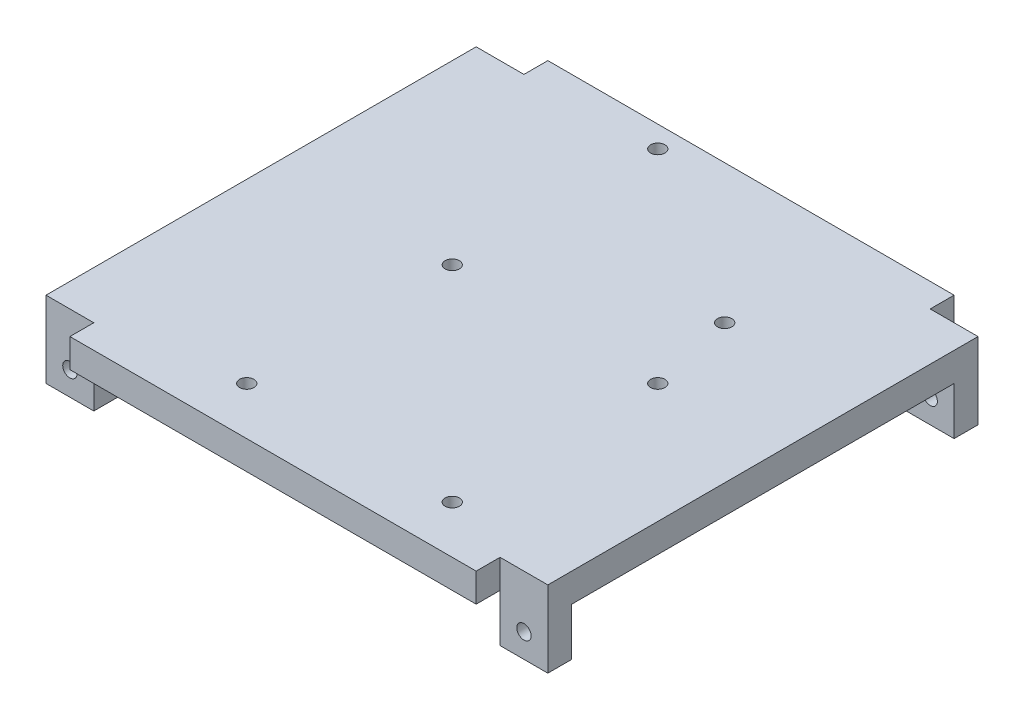
ISO-10303-21;
HEADER;
FILE_DESCRIPTION(('STEP AP214'),'2;1');
FILE_NAME('part.step','',(''),(''),'','','');
FILE_SCHEMA(('AUTOMOTIVE_DESIGN { 1 0 10303 214 1 1 1 1 }'));
ENDSEC;
DATA;
#1=APPLICATION_CONTEXT('core data for automotive mechanical design processes');
#2=APPLICATION_PROTOCOL_DEFINITION('international standard','automotive_design',2000,#1);
#3=PRODUCT_CONTEXT('',#1,'mechanical');
#4=PRODUCT('Part','Part','',(#3));
#5=PRODUCT_RELATED_PRODUCT_CATEGORY('part','',(#4));
#6=PRODUCT_DEFINITION_FORMATION('','',#4);
#7=PRODUCT_DEFINITION_CONTEXT('part definition',#1,'design');
#8=PRODUCT_DEFINITION('design','',#6,#7);
#9=PRODUCT_DEFINITION_SHAPE('','',#8);
#10=(LENGTH_UNIT() NAMED_UNIT(*) SI_UNIT(.MILLI.,.METRE.));
#11=(NAMED_UNIT(*) PLANE_ANGLE_UNIT() SI_UNIT($,.RADIAN.));
#12=(NAMED_UNIT(*) SI_UNIT($,.STERADIAN.) SOLID_ANGLE_UNIT());
#13=UNCERTAINTY_MEASURE_WITH_UNIT(LENGTH_MEASURE(1.E-05),#10,'distance_accuracy_value','');
#14=(GEOMETRIC_REPRESENTATION_CONTEXT(3) GLOBAL_UNCERTAINTY_ASSIGNED_CONTEXT((#13)) GLOBAL_UNIT_ASSIGNED_CONTEXT((#10,
#11,#12)) REPRESENTATION_CONTEXT('',''));
#15=CARTESIAN_POINT('',(0.,0.,0.));
#16=DIRECTION('',(0.,0.,1.));
#17=DIRECTION('',(1.,0.,0.));
#18=AXIS2_PLACEMENT_3D('',#15,#16,#17);
#19=CARTESIAN_POINT('',(0.,0.,0.));
#20=DIRECTION('',(0.,-1.,0.));
#21=DIRECTION('',(0.,0.,-1.));
#22=AXIS2_PLACEMENT_3D('',#19,#20,#21);
#23=PLANE('',#22);
#24=CARTESIAN_POINT('',(76.,0.,-71.));
#25=DIRECTION('',(0.,-1.,0.));
#26=DIRECTION('',(0.,0.,-1.));
#27=AXIS2_PLACEMENT_3D('',#24,#25,#26);
#28=CIRCLE('',#27,1.5);
#29=CARTESIAN_POINT('',(76.,0.,-72.5));
#30=VERTEX_POINT('',#29);
#31=EDGE_CURVE('E418',#30,#30,#28,.T.);
#32=ORIENTED_EDGE('',*,*,#31,.F.);
#33=EDGE_LOOP('',(#32));
#34=FACE_BOUND('',#33,.T.);
#35=CARTESIAN_POINT('',(37.5,0.,-95.5));
#36=DIRECTION('',(0.,-1.,0.));
#37=DIRECTION('',(0.,0.,-1.));
#38=AXIS2_PLACEMENT_3D('',#35,#36,#37);
#39=CIRCLE('',#38,1.5);
#40=CARTESIAN_POINT('',(37.5,0.,-97.));
#41=VERTEX_POINT('',#40);
#42=EDGE_CURVE('E412',#41,#41,#39,.T.);
#43=ORIENTED_EDGE('',*,*,#42,.F.);
#44=EDGE_LOOP('',(#43));
#45=FACE_BOUND('',#44,.T.);
#46=CARTESIAN_POINT('',(80.,0.,-10.));
#47=DIRECTION('',(0.,-1.,0.));
#48=DIRECTION('',(0.,0.,-1.));
#49=AXIS2_PLACEMENT_3D('',#46,#47,#48);
#50=CIRCLE('',#49,1.5);
#51=CARTESIAN_POINT('',(80.,0.,-11.5));
#52=VERTEX_POINT('',#51);
#53=EDGE_CURVE('E406',#52,#52,#50,.T.);
#54=ORIENTED_EDGE('',*,*,#53,.F.);
#55=EDGE_LOOP('',(#54));
#56=FACE_BOUND('',#55,.T.);
#57=CARTESIAN_POINT('',(80.,0.,-53.));
#58=DIRECTION('',(0.,-1.,0.));
#59=DIRECTION('',(0.,0.,-1.));
#60=AXIS2_PLACEMENT_3D('',#57,#58,#59);
#61=CIRCLE('',#60,1.5);
#62=CARTESIAN_POINT('',(80.,0.,-54.5));
#63=VERTEX_POINT('',#62);
#64=EDGE_CURVE('E400',#63,#63,#61,.T.);
#65=ORIENTED_EDGE('',*,*,#64,.F.);
#66=EDGE_LOOP('',(#65));
#67=FACE_BOUND('',#66,.T.);
#68=CARTESIAN_POINT('',(37.,0.,-53.));
#69=DIRECTION('',(0.,-1.,0.));
#70=DIRECTION('',(0.,0.,-1.));
#71=AXIS2_PLACEMENT_3D('',#68,#69,#70);
#72=CIRCLE('',#71,1.5);
#73=CARTESIAN_POINT('',(37.,0.,-54.5));
#74=VERTEX_POINT('',#73);
#75=EDGE_CURVE('E394',#74,#74,#72,.T.);
#76=ORIENTED_EDGE('',*,*,#75,.F.);
#77=EDGE_LOOP('',(#76));
#78=FACE_BOUND('',#77,.T.);
#79=CARTESIAN_POINT('',(37.,0.,-10.));
#80=DIRECTION('',(0.,-1.,0.));
#81=DIRECTION('',(0.,0.,-1.));
#82=AXIS2_PLACEMENT_3D('',#79,#80,#81);
#83=CIRCLE('',#82,1.5);
#84=CARTESIAN_POINT('',(37.,0.,-11.5));
#85=VERTEX_POINT('',#84);
#86=EDGE_CURVE('E388',#85,#85,#83,.T.);
#87=ORIENTED_EDGE('',*,*,#86,.F.);
#88=EDGE_LOOP('',(#87));
#89=FACE_BOUND('',#88,.T.);
#90=DIRECTION('',(-1.,0.,0.));
#91=VECTOR('',#90,1.);
#92=CARTESIAN_POINT('',(0.,0.,-90.));
#93=LINE('',#92,#91);
#94=CARTESIAN_POINT('',(9.99999999999999,0.,-90.));
#95=VERTEX_POINT('',#94);
#96=CARTESIAN_POINT('',(0.,0.,-90.));
#97=VERTEX_POINT('',#96);
#98=EDGE_CURVE('E214',#95,#97,#93,.T.);
#99=ORIENTED_EDGE('',*,*,#98,.F.);
#100=DIRECTION('',(0.,0.,1.));
#101=VECTOR('',#100,1.);
#102=CARTESIAN_POINT('',(9.99999999999998,0.,-95.));
#103=LINE('',#102,#101);
#104=CARTESIAN_POINT('',(9.99999999999998,0.,-95.));
#105=VERTEX_POINT('',#104);
#106=EDGE_CURVE('E216',#105,#95,#103,.T.);
#107=ORIENTED_EDGE('',*,*,#106,.F.);
#108=DIRECTION('',(0.,0.,1.));
#109=VECTOR('',#108,1.);
#110=CARTESIAN_POINT('',(10.,0.,-100.));
#111=LINE('',#110,#109);
#112=CARTESIAN_POINT('',(10.,0.,-100.));
#113=VERTEX_POINT('',#112);
#114=EDGE_CURVE('E326',#113,#105,#111,.T.);
#115=ORIENTED_EDGE('',*,*,#114,.F.);
#116=DIRECTION('',(-1.,0.,0.));
#117=VECTOR('',#116,1.);
#118=CARTESIAN_POINT('',(0.,0.,-100.));
#119=LINE('',#118,#117);
#120=CARTESIAN_POINT('',(95.,0.,-100.));
#121=VERTEX_POINT('',#120);
#122=EDGE_CURVE('E354',#121,#113,#119,.T.);
#123=ORIENTED_EDGE('',*,*,#122,.F.);
#124=DIRECTION('',(0.,0.,-1.));
#125=VECTOR('',#124,1.);
#126=CARTESIAN_POINT('',(95.,0.,-100.));
#127=LINE('',#126,#125);
#128=CARTESIAN_POINT('',(95.,0.,-95.));
#129=VERTEX_POINT('',#128);
#130=EDGE_CURVE('E336',#129,#121,#127,.T.);
#131=ORIENTED_EDGE('',*,*,#130,.F.);
#132=DIRECTION('',(0.,0.,-1.));
#133=VECTOR('',#132,1.);
#134=CARTESIAN_POINT('',(95.,0.,-95.));
#135=LINE('',#134,#133);
#136=CARTESIAN_POINT('',(95.,0.,-90.));
#137=VERTEX_POINT('',#136);
#138=EDGE_CURVE('E279',#137,#129,#135,.T.);
#139=ORIENTED_EDGE('',*,*,#138,.F.);
#140=DIRECTION('',(-1.,0.,0.));
#141=VECTOR('',#140,1.);
#142=CARTESIAN_POINT('',(105.,0.,-90.));
#143=LINE('',#142,#141);
#144=CARTESIAN_POINT('',(105.,0.,-90.));
#145=VERTEX_POINT('',#144);
#146=EDGE_CURVE('E274',#145,#137,#143,.T.);
#147=ORIENTED_EDGE('',*,*,#146,.F.);
#148=DIRECTION('',(0.,0.,-1.));
#149=VECTOR('',#148,1.);
#150=CARTESIAN_POINT('',(105.,0.,0.));
#151=LINE('',#150,#149);
#152=CARTESIAN_POINT('',(105.,0.,-10.));
#153=VERTEX_POINT('',#152);
#154=EDGE_CURVE('E50',#153,#145,#151,.T.);
#155=ORIENTED_EDGE('',*,*,#154,.F.);
#156=DIRECTION('',(1.,0.,0.));
#157=VECTOR('',#156,1.);
#158=CARTESIAN_POINT('',(105.,0.,-10.));
#159=LINE('',#158,#157);
#160=CARTESIAN_POINT('',(95.,0.,-10.));
#161=VERTEX_POINT('',#160);
#162=EDGE_CURVE('E259',#161,#153,#159,.T.);
#163=ORIENTED_EDGE('',*,*,#162,.F.);
#164=DIRECTION('',(0.,0.,-1.));
#165=VECTOR('',#164,1.);
#166=CARTESIAN_POINT('',(95.,0.,-5.00000000000001));
#167=LINE('',#166,#165);
#168=CARTESIAN_POINT('',(95.,0.,-5.00000000000001));
#169=VERTEX_POINT('',#168);
#170=EDGE_CURVE('E254',#169,#161,#167,.T.);
#171=ORIENTED_EDGE('',*,*,#170,.F.);
#172=DIRECTION('',(0.,0.,-1.));
#173=VECTOR('',#172,1.);
#174=CARTESIAN_POINT('',(95.,0.,0.));
#175=LINE('',#174,#173);
#176=CARTESIAN_POINT('',(95.,0.,0.));
#177=VERTEX_POINT('',#176);
#178=EDGE_CURVE('E310',#177,#169,#175,.T.);
#179=ORIENTED_EDGE('',*,*,#178,.F.);
#180=DIRECTION('',(1.,0.,0.));
#181=VECTOR('',#180,1.);
#182=CARTESIAN_POINT('',(0.,0.,0.));
#183=LINE('',#182,#181);
#184=CARTESIAN_POINT('',(10.,0.,0.));
#185=VERTEX_POINT('',#184);
#186=EDGE_CURVE('E58',#185,#177,#183,.T.);
#187=ORIENTED_EDGE('',*,*,#186,.F.);
#188=DIRECTION('',(0.,0.,1.));
#189=VECTOR('',#188,1.);
#190=CARTESIAN_POINT('',(10.,0.,0.));
#191=LINE('',#190,#189);
#192=CARTESIAN_POINT('',(9.99999999999999,0.,-5.00000000000001));
#193=VERTEX_POINT('',#192);
#194=EDGE_CURVE('E295',#193,#185,#191,.T.);
#195=ORIENTED_EDGE('',*,*,#194,.F.);
#196=DIRECTION('',(0.,0.,1.));
#197=VECTOR('',#196,1.);
#198=CARTESIAN_POINT('',(9.99999999999998,0.,-5.));
#199=LINE('',#198,#197);
#200=CARTESIAN_POINT('',(9.99999999999998,0.,-10.));
#201=VERTEX_POINT('',#200);
#202=EDGE_CURVE('E236',#201,#193,#199,.T.);
#203=ORIENTED_EDGE('',*,*,#202,.F.);
#204=DIRECTION('',(1.,0.,0.));
#205=VECTOR('',#204,1.);
#206=CARTESIAN_POINT('',(0.,0.,-10.));
#207=LINE('',#206,#205);
#208=CARTESIAN_POINT('',(0.,0.,-10.));
#209=VERTEX_POINT('',#208);
#210=EDGE_CURVE('E231',#209,#201,#207,.T.);
#211=ORIENTED_EDGE('',*,*,#210,.F.);
#212=DIRECTION('',(0.,0.,1.));
#213=VECTOR('',#212,1.);
#214=CARTESIAN_POINT('',(0.,0.,0.));
#215=LINE('',#214,#213);
#216=EDGE_CURVE('E351',#97,#209,#215,.T.);
#217=ORIENTED_EDGE('',*,*,#216,.F.);
#218=EDGE_LOOP('',(#99,#107,#115,#123,#131,#139,#147,#155,#163,#171,#179,#187,#195,#203,#211,#217));
#219=FACE_BOUND('',#218,.T.);
#220=ADVANCED_FACE('F33',(#34,#45,#56,#67,#78,#89,#219),#23,.T.);
#221=CARTESIAN_POINT('',(0.,6.,0.));
#222=DIRECTION('',(1.,0.,0.));
#223=DIRECTION('',(0.,0.,-1.));
#224=AXIS2_PLACEMENT_3D('',#221,#222,#223);
#225=PLANE('',#224);
#226=DIRECTION('',(0.,-1.,0.));
#227=VECTOR('',#226,1.);
#228=CARTESIAN_POINT('',(0.,10.,-95.));
#229=LINE('',#228,#227);
#230=CARTESIAN_POINT('',(0.,6.,-95.));
#231=VERTEX_POINT('',#230);
#232=CARTESIAN_POINT('',(0.,-10.,-95.));
#233=VERTEX_POINT('',#232);
#234=EDGE_CURVE('E188',#231,#233,#229,.T.);
#235=ORIENTED_EDGE('',*,*,#234,.T.);
#236=DIRECTION('',(0.,0.,-1.));
#237=VECTOR('',#236,1.);
#238=CARTESIAN_POINT('',(0.,-10.,-95.));
#239=LINE('',#238,#237);
#240=CARTESIAN_POINT('',(0.,-10.,-90.));
#241=VERTEX_POINT('',#240);
#242=EDGE_CURVE('E192',#241,#233,#239,.T.);
#243=ORIENTED_EDGE('',*,*,#242,.F.);
#244=DIRECTION('',(0.,1.,0.));
#245=VECTOR('',#244,1.);
#246=CARTESIAN_POINT('',(0.,-10.,-90.));
#247=LINE('',#246,#245);
#248=EDGE_CURVE('E224',#241,#97,#247,.T.);
#249=ORIENTED_EDGE('',*,*,#248,.T.);
#250=ORIENTED_EDGE('',*,*,#216,.T.);
#251=DIRECTION('',(0.,1.,0.));
#252=VECTOR('',#251,1.);
#253=CARTESIAN_POINT('',(0.,-10.,-10.));
#254=LINE('',#253,#252);
#255=CARTESIAN_POINT('',(0.,-10.,-10.));
#256=VERTEX_POINT('',#255);
#257=EDGE_CURVE('E251',#256,#209,#254,.T.);
#258=ORIENTED_EDGE('',*,*,#257,.F.);
#259=DIRECTION('',(0.,0.,-1.));
#260=VECTOR('',#259,1.);
#261=CARTESIAN_POINT('',(0.,-10.,-5.00000000000001));
#262=LINE('',#261,#260);
#263=CARTESIAN_POINT('',(0.,-10.,-5.00000000000001));
#264=VERTEX_POINT('',#263);
#265=EDGE_CURVE('E232',#264,#256,#262,.T.);
#266=ORIENTED_EDGE('',*,*,#265,.F.);
#267=DIRECTION('',(0.,-1.,0.));
#268=VECTOR('',#267,1.);
#269=CARTESIAN_POINT('',(0.,10.,-5.00000000000001));
#270=LINE('',#269,#268);
#271=CARTESIAN_POINT('',(0.,6.,-5.00000000000001));
#272=VERTEX_POINT('',#271);
#273=EDGE_CURVE('E297',#272,#264,#270,.T.);
#274=ORIENTED_EDGE('',*,*,#273,.F.);
#275=DIRECTION('',(0.,0.,1.));
#276=VECTOR('',#275,1.);
#277=CARTESIAN_POINT('',(0.,6.,0.));
#278=LINE('',#277,#276);
#279=EDGE_CURVE('E195',#231,#272,#278,.T.);
#280=ORIENTED_EDGE('',*,*,#279,.F.);
#281=EDGE_LOOP('',(#235,#243,#249,#250,#258,#266,#274,#280));
#282=FACE_BOUND('',#281,.T.);
#283=ADVANCED_FACE('F35',(#282),#225,.F.);
#284=CARTESIAN_POINT('',(0.,6.,0.));
#285=DIRECTION('',(0.,0.,-1.));
#286=DIRECTION('',(-1.,0.,0.));
#287=AXIS2_PLACEMENT_3D('',#284,#285,#286);
#288=PLANE('',#287);
#289=DIRECTION('',(1.,0.,0.));
#290=VECTOR('',#289,1.);
#291=CARTESIAN_POINT('',(0.,6.,0.));
#292=LINE('',#291,#290);
#293=CARTESIAN_POINT('',(10.,6.,0.));
#294=VERTEX_POINT('',#293);
#295=CARTESIAN_POINT('',(95.,6.,0.));
#296=VERTEX_POINT('',#295);
#297=EDGE_CURVE('E353',#294,#296,#292,.T.);
#298=ORIENTED_EDGE('',*,*,#297,.F.);
#299=DIRECTION('',(0.,-1.,0.));
#300=VECTOR('',#299,1.);
#301=CARTESIAN_POINT('',(10.,10.,0.));
#302=LINE('',#301,#300);
#303=EDGE_CURVE('E298',#294,#185,#302,.T.);
#304=ORIENTED_EDGE('',*,*,#303,.T.);
#305=ORIENTED_EDGE('',*,*,#186,.T.);
#306=DIRECTION('',(0.,-1.,0.));
#307=VECTOR('',#306,1.);
#308=CARTESIAN_POINT('',(95.,10.,0.));
#309=LINE('',#308,#307);
#310=EDGE_CURVE('E313',#296,#177,#309,.T.);
#311=ORIENTED_EDGE('',*,*,#310,.F.);
#312=EDGE_LOOP('',(#298,#304,#305,#311));
#313=FACE_BOUND('',#312,.T.);
#314=ADVANCED_FACE('F545',(#313),#288,.F.);
#315=CARTESIAN_POINT('',(105.,6.,0.));
#316=DIRECTION('',(-1.,0.,0.));
#317=DIRECTION('',(0.,0.,1.));
#318=AXIS2_PLACEMENT_3D('',#315,#316,#317);
#319=PLANE('',#318);
#320=DIRECTION('',(0.,0.,-1.));
#321=VECTOR('',#320,1.);
#322=CARTESIAN_POINT('',(105.,6.,0.));
#323=LINE('',#322,#321);
#324=CARTESIAN_POINT('',(105.,6.,-5.00000000000001));
#325=VERTEX_POINT('',#324);
#326=CARTESIAN_POINT('',(105.,6.,-95.));
#327=VERTEX_POINT('',#326);
#328=EDGE_CURVE('E42',#325,#327,#323,.T.);
#329=ORIENTED_EDGE('',*,*,#328,.F.);
#330=DIRECTION('',(0.,-1.,0.));
#331=VECTOR('',#330,1.);
#332=CARTESIAN_POINT('',(105.,10.,-5.00000000000001));
#333=LINE('',#332,#331);
#334=CARTESIAN_POINT('',(105.,-10.,-5.00000000000001));
#335=VERTEX_POINT('',#334);
#336=EDGE_CURVE('E314',#325,#335,#333,.T.);
#337=ORIENTED_EDGE('',*,*,#336,.T.);
#338=DIRECTION('',(0.,0.,1.));
#339=VECTOR('',#338,1.);
#340=CARTESIAN_POINT('',(105.,-10.,-5.00000000000001));
#341=LINE('',#340,#339);
#342=CARTESIAN_POINT('',(105.,-10.,-10.));
#343=VERTEX_POINT('',#342);
#344=EDGE_CURVE('E255',#343,#335,#341,.T.);
#345=ORIENTED_EDGE('',*,*,#344,.F.);
#346=DIRECTION('',(0.,1.,0.));
#347=VECTOR('',#346,1.);
#348=CARTESIAN_POINT('',(105.,-10.,-10.));
#349=LINE('',#348,#347);
#350=EDGE_CURVE('E265',#343,#153,#349,.T.);
#351=ORIENTED_EDGE('',*,*,#350,.T.);
#352=ORIENTED_EDGE('',*,*,#154,.T.);
#353=DIRECTION('',(0.,1.,0.));
#354=VECTOR('',#353,1.);
#355=CARTESIAN_POINT('',(105.,-10.,-90.));
#356=LINE('',#355,#354);
#357=CARTESIAN_POINT('',(105.,-10.,-90.));
#358=VERTEX_POINT('',#357);
#359=EDGE_CURVE('E294',#358,#145,#356,.T.);
#360=ORIENTED_EDGE('',*,*,#359,.F.);
#361=DIRECTION('',(0.,0.,1.));
#362=VECTOR('',#361,1.);
#363=CARTESIAN_POINT('',(105.,-10.,-95.));
#364=LINE('',#363,#362);
#365=CARTESIAN_POINT('',(105.,-10.,-95.));
#366=VERTEX_POINT('',#365);
#367=EDGE_CURVE('E275',#366,#358,#364,.T.);
#368=ORIENTED_EDGE('',*,*,#367,.F.);
#369=DIRECTION('',(0.,-1.,0.));
#370=VECTOR('',#369,1.);
#371=CARTESIAN_POINT('',(105.,10.,-95.));
#372=LINE('',#371,#370);
#373=EDGE_CURVE('E338',#327,#366,#372,.T.);
#374=ORIENTED_EDGE('',*,*,#373,.F.);
#375=EDGE_LOOP('',(#329,#337,#345,#351,#352,#360,#368,#374));
#376=FACE_BOUND('',#375,.T.);
#377=ADVANCED_FACE('F494',(#376),#319,.F.);
#378=CARTESIAN_POINT('',(0.,6.,-100.));
#379=DIRECTION('',(0.,0.,1.));
#380=DIRECTION('',(1.,0.,0.));
#381=AXIS2_PLACEMENT_3D('',#378,#379,#380);
#382=PLANE('',#381);
#383=ORIENTED_EDGE('',*,*,#122,.T.);
#384=DIRECTION('',(0.,-1.,0.));
#385=VECTOR('',#384,1.);
#386=CARTESIAN_POINT('',(10.,10.,-100.));
#387=LINE('',#386,#385);
#388=CARTESIAN_POINT('',(10.,6.,-100.));
#389=VERTEX_POINT('',#388);
#390=EDGE_CURVE('E328',#389,#113,#387,.T.);
#391=ORIENTED_EDGE('',*,*,#390,.F.);
#392=DIRECTION('',(-1.,0.,0.));
#393=VECTOR('',#392,1.);
#394=CARTESIAN_POINT('',(0.,6.,-100.));
#395=LINE('',#394,#393);
#396=CARTESIAN_POINT('',(95.,6.,-100.));
#397=VERTEX_POINT('',#396);
#398=EDGE_CURVE('E11',#397,#389,#395,.T.);
#399=ORIENTED_EDGE('',*,*,#398,.F.);
#400=DIRECTION('',(0.,-1.,0.));
#401=VECTOR('',#400,1.);
#402=CARTESIAN_POINT('',(95.,10.,-100.));
#403=LINE('',#402,#401);
#404=EDGE_CURVE('E339',#397,#121,#403,.T.);
#405=ORIENTED_EDGE('',*,*,#404,.T.);
#406=EDGE_LOOP('',(#383,#391,#399,#405));
#407=FACE_BOUND('',#406,.T.);
#408=ADVANCED_FACE('F482',(#407),#382,.F.);
#409=CARTESIAN_POINT('',(0.,6.,0.));
#410=DIRECTION('',(0.,-1.,0.));
#411=DIRECTION('',(0.,0.,-1.));
#412=AXIS2_PLACEMENT_3D('',#409,#410,#411);
#413=PLANE('',#412);
#414=CARTESIAN_POINT('',(76.,6.,-71.));
#415=DIRECTION('',(0.,-1.,0.));
#416=DIRECTION('',(0.,0.,-1.));
#417=AXIS2_PLACEMENT_3D('',#414,#415,#416);
#418=CIRCLE('',#417,1.5);
#419=CARTESIAN_POINT('',(76.,6.,-72.5));
#420=VERTEX_POINT('',#419);
#421=EDGE_CURVE('E415',#420,#420,#418,.T.);
#422=ORIENTED_EDGE('',*,*,#421,.T.);
#423=EDGE_LOOP('',(#422));
#424=FACE_BOUND('',#423,.T.);
#425=CARTESIAN_POINT('',(37.5,6.,-95.5));
#426=DIRECTION('',(0.,-1.,0.));
#427=DIRECTION('',(0.,0.,-1.));
#428=AXIS2_PLACEMENT_3D('',#425,#426,#427);
#429=CIRCLE('',#428,1.5);
#430=CARTESIAN_POINT('',(37.5,6.,-97.));
#431=VERTEX_POINT('',#430);
#432=EDGE_CURVE('E409',#431,#431,#429,.T.);
#433=ORIENTED_EDGE('',*,*,#432,.T.);
#434=EDGE_LOOP('',(#433));
#435=FACE_BOUND('',#434,.T.);
#436=CARTESIAN_POINT('',(80.,6.,-10.));
#437=DIRECTION('',(0.,-1.,0.));
#438=DIRECTION('',(0.,0.,-1.));
#439=AXIS2_PLACEMENT_3D('',#436,#437,#438);
#440=CIRCLE('',#439,1.5);
#441=CARTESIAN_POINT('',(80.,6.,-11.5));
#442=VERTEX_POINT('',#441);
#443=EDGE_CURVE('E403',#442,#442,#440,.T.);
#444=ORIENTED_EDGE('',*,*,#443,.T.);
#445=EDGE_LOOP('',(#444));
#446=FACE_BOUND('',#445,.T.);
#447=CARTESIAN_POINT('',(80.,6.,-53.));
#448=DIRECTION('',(0.,-1.,0.));
#449=DIRECTION('',(0.,0.,-1.));
#450=AXIS2_PLACEMENT_3D('',#447,#448,#449);
#451=CIRCLE('',#450,1.5);
#452=CARTESIAN_POINT('',(80.,6.,-54.5));
#453=VERTEX_POINT('',#452);
#454=EDGE_CURVE('E397',#453,#453,#451,.T.);
#455=ORIENTED_EDGE('',*,*,#454,.T.);
#456=EDGE_LOOP('',(#455));
#457=FACE_BOUND('',#456,.T.);
#458=CARTESIAN_POINT('',(37.,6.,-53.));
#459=DIRECTION('',(0.,-1.,0.));
#460=DIRECTION('',(0.,0.,-1.));
#461=AXIS2_PLACEMENT_3D('',#458,#459,#460);
#462=CIRCLE('',#461,1.5);
#463=CARTESIAN_POINT('',(37.,6.,-54.5));
#464=VERTEX_POINT('',#463);
#465=EDGE_CURVE('E391',#464,#464,#462,.T.);
#466=ORIENTED_EDGE('',*,*,#465,.T.);
#467=EDGE_LOOP('',(#466));
#468=FACE_BOUND('',#467,.T.);
#469=CARTESIAN_POINT('',(37.,6.,-10.));
#470=DIRECTION('',(0.,-1.,0.));
#471=DIRECTION('',(0.,0.,-1.));
#472=AXIS2_PLACEMENT_3D('',#469,#470,#471);
#473=CIRCLE('',#472,1.5);
#474=CARTESIAN_POINT('',(37.,6.,-11.5));
#475=VERTEX_POINT('',#474);
#476=EDGE_CURVE('E387',#475,#475,#473,.T.);
#477=ORIENTED_EDGE('',*,*,#476,.T.);
#478=EDGE_LOOP('',(#477));
#479=FACE_BOUND('',#478,.T.);
#480=DIRECTION('',(1.,0.,0.));
#481=VECTOR('',#480,1.);
#482=CARTESIAN_POINT('',(0.,6.,-5.00000000000001));
#483=LINE('',#482,#481);
#484=CARTESIAN_POINT('',(9.99999999999999,6.,-5.00000000000001));
#485=VERTEX_POINT('',#484);
#486=EDGE_CURVE('E300',#272,#485,#483,.T.);
#487=ORIENTED_EDGE('',*,*,#486,.T.);
#488=DIRECTION('',(0.,0.,1.));
#489=VECTOR('',#488,1.);
#490=CARTESIAN_POINT('',(10.,6.,0.));
#491=LINE('',#490,#489);
#492=EDGE_CURVE('E307',#485,#294,#491,.T.);
#493=ORIENTED_EDGE('',*,*,#492,.T.);
#494=ORIENTED_EDGE('',*,*,#297,.T.);
#495=DIRECTION('',(0.,0.,-1.));
#496=VECTOR('',#495,1.);
#497=CARTESIAN_POINT('',(95.,6.,0.));
#498=LINE('',#497,#496);
#499=CARTESIAN_POINT('',(95.,6.,-5.00000000000001));
#500=VERTEX_POINT('',#499);
#501=EDGE_CURVE('E316',#296,#500,#498,.T.);
#502=ORIENTED_EDGE('',*,*,#501,.T.);
#503=DIRECTION('',(1.,0.,0.));
#504=VECTOR('',#503,1.);
#505=CARTESIAN_POINT('',(0.,6.,-5.00000000000002));
#506=LINE('',#505,#504);
#507=EDGE_CURVE('E323',#500,#325,#506,.T.);
#508=ORIENTED_EDGE('',*,*,#507,.T.);
#509=ORIENTED_EDGE('',*,*,#328,.T.);
#510=DIRECTION('',(-1.,0.,0.));
#511=VECTOR('',#510,1.);
#512=CARTESIAN_POINT('',(0.,6.,-95.));
#513=LINE('',#512,#511);
#514=CARTESIAN_POINT('',(95.,6.,-95.));
#515=VERTEX_POINT('',#514);
#516=EDGE_CURVE('E342',#327,#515,#513,.T.);
#517=ORIENTED_EDGE('',*,*,#516,.T.);
#518=DIRECTION('',(0.,0.,-1.));
#519=VECTOR('',#518,1.);
#520=CARTESIAN_POINT('',(95.,6.,0.));
#521=LINE('',#520,#519);
#522=EDGE_CURVE('E348',#515,#397,#521,.T.);
#523=ORIENTED_EDGE('',*,*,#522,.T.);
#524=ORIENTED_EDGE('',*,*,#398,.T.);
#525=DIRECTION('',(0.,0.,1.));
#526=VECTOR('',#525,1.);
#527=CARTESIAN_POINT('',(10.,6.,0.));
#528=LINE('',#527,#526);
#529=CARTESIAN_POINT('',(10.,6.,-95.));
#530=VERTEX_POINT('',#529);
#531=EDGE_CURVE('E198',#389,#530,#528,.T.);
#532=ORIENTED_EDGE('',*,*,#531,.T.);
#533=DIRECTION('',(-1.,0.,0.));
#534=VECTOR('',#533,1.);
#535=CARTESIAN_POINT('',(0.,6.,-95.));
#536=LINE('',#535,#534);
#537=EDGE_CURVE('E334',#530,#231,#536,.T.);
#538=ORIENTED_EDGE('',*,*,#537,.T.);
#539=ORIENTED_EDGE('',*,*,#279,.T.);
#540=EDGE_LOOP('',(#487,#493,#494,#502,#508,#509,#517,#523,#524,#532,#538,#539));
#541=FACE_BOUND('',#540,.T.);
#542=ADVANCED_FACE('F424',(#424,#435,#446,#457,#468,#479,#541),#413,.F.);
#543=CARTESIAN_POINT('',(95.,10.,-100.));
#544=DIRECTION('',(-1.,0.,0.));
#545=DIRECTION('',(0.,0.,1.));
#546=AXIS2_PLACEMENT_3D('',#543,#544,#545);
#547=PLANE('',#546);
#548=DIRECTION('',(0.,-1.,0.));
#549=VECTOR('',#548,1.);
#550=CARTESIAN_POINT('',(95.,10.,-95.));
#551=LINE('',#550,#549);
#552=EDGE_CURVE('E343',#515,#129,#551,.T.);
#553=ORIENTED_EDGE('',*,*,#552,.T.);
#554=ORIENTED_EDGE('',*,*,#130,.T.);
#555=ORIENTED_EDGE('',*,*,#404,.F.);
#556=ORIENTED_EDGE('',*,*,#522,.F.);
#557=EDGE_LOOP('',(#553,#554,#555,#556));
#558=FACE_BOUND('',#557,.T.);
#559=ADVANCED_FACE('F485',(#558),#547,.F.);
#560=CARTESIAN_POINT('',(105.,10.,-95.));
#561=DIRECTION('',(0.,0.,1.));
#562=DIRECTION('',(1.,0.,0.));
#563=AXIS2_PLACEMENT_3D('',#560,#561,#562);
#564=PLANE('',#563);
#565=CARTESIAN_POINT('',(100.,-5.,-95.));
#566=DIRECTION('',(0.,0.,-1.));
#567=DIRECTION('',(-1.,0.,0.));
#568=AXIS2_PLACEMENT_3D('',#565,#566,#567);
#569=CIRCLE('',#568,1.5);
#570=CARTESIAN_POINT('',(98.5,-5.,-95.));
#571=VERTEX_POINT('',#570);
#572=EDGE_CURVE('E369',#571,#571,#569,.T.);
#573=ORIENTED_EDGE('',*,*,#572,.F.);
#574=EDGE_LOOP('',(#573));
#575=FACE_BOUND('',#574,.T.);
#576=ORIENTED_EDGE('',*,*,#373,.T.);
#577=DIRECTION('',(1.,0.,0.));
#578=VECTOR('',#577,1.);
#579=CARTESIAN_POINT('',(105.,-10.,-95.));
#580=LINE('',#579,#578);
#581=CARTESIAN_POINT('',(95.,-10.,-95.));
#582=VERTEX_POINT('',#581);
#583=EDGE_CURVE('E283',#582,#366,#580,.T.);
#584=ORIENTED_EDGE('',*,*,#583,.F.);
#585=DIRECTION('',(0.,1.,0.));
#586=VECTOR('',#585,1.);
#587=CARTESIAN_POINT('',(95.,-10.,-95.));
#588=LINE('',#587,#586);
#589=EDGE_CURVE('E286',#582,#129,#588,.T.);
#590=ORIENTED_EDGE('',*,*,#589,.T.);
#591=ORIENTED_EDGE('',*,*,#552,.F.);
#592=ORIENTED_EDGE('',*,*,#516,.F.);
#593=EDGE_LOOP('',(#576,#584,#590,#591,#592));
#594=FACE_BOUND('',#593,.T.);
#595=ADVANCED_FACE('F491',(#575,#594),#564,.F.);
#596=CARTESIAN_POINT('',(0.,10.,-95.));
#597=DIRECTION('',(0.,0.,1.));
#598=DIRECTION('',(1.,0.,0.));
#599=AXIS2_PLACEMENT_3D('',#596,#597,#598);
#600=PLANE('',#599);
#601=CARTESIAN_POINT('',(4.99999999999998,-5.,-95.));
#602=DIRECTION('',(0.,0.,-1.));
#603=DIRECTION('',(-1.,0.,0.));
#604=AXIS2_PLACEMENT_3D('',#601,#602,#603);
#605=CIRCLE('',#604,1.5);
#606=CARTESIAN_POINT('',(3.49999999999998,-5.,-95.));
#607=VERTEX_POINT('',#606);
#608=EDGE_CURVE('E384',#607,#607,#605,.T.);
#609=ORIENTED_EDGE('',*,*,#608,.F.);
#610=EDGE_LOOP('',(#609));
#611=FACE_BOUND('',#610,.T.);
#612=DIRECTION('',(0.,-1.,0.));
#613=VECTOR('',#612,1.);
#614=CARTESIAN_POINT('',(10.,10.,-95.));
#615=LINE('',#614,#613);
#616=EDGE_CURVE('E199',#530,#105,#615,.T.);
#617=ORIENTED_EDGE('',*,*,#616,.T.);
#618=DIRECTION('',(0.,1.,0.));
#619=VECTOR('',#618,1.);
#620=CARTESIAN_POINT('',(9.99999999999998,-10.,-95.));
#621=LINE('',#620,#619);
#622=CARTESIAN_POINT('',(9.99999999999998,-10.,-95.));
#623=VERTEX_POINT('',#622);
#624=EDGE_CURVE('E205',#623,#105,#621,.T.);
#625=ORIENTED_EDGE('',*,*,#624,.F.);
#626=DIRECTION('',(1.,0.,0.));
#627=VECTOR('',#626,1.);
#628=CARTESIAN_POINT('',(0.,-10.,-95.));
#629=LINE('',#628,#627);
#630=EDGE_CURVE('E202',#233,#623,#629,.T.);
#631=ORIENTED_EDGE('',*,*,#630,.F.);
#632=ORIENTED_EDGE('',*,*,#234,.F.);
#633=ORIENTED_EDGE('',*,*,#537,.F.);
#634=EDGE_LOOP('',(#617,#625,#631,#632,#633));
#635=FACE_BOUND('',#634,.T.);
#636=ADVANCED_FACE('F204',(#611,#635),#600,.F.);
#637=CARTESIAN_POINT('',(10.,10.,-100.));
#638=DIRECTION('',(1.,0.,0.));
#639=DIRECTION('',(0.,0.,-1.));
#640=AXIS2_PLACEMENT_3D('',#637,#638,#639);
#641=PLANE('',#640);
#642=ORIENTED_EDGE('',*,*,#390,.T.);
#643=ORIENTED_EDGE('',*,*,#114,.T.);
#644=ORIENTED_EDGE('',*,*,#616,.F.);
#645=ORIENTED_EDGE('',*,*,#531,.F.);
#646=EDGE_LOOP('',(#642,#643,#644,#645));
#647=FACE_BOUND('',#646,.T.);
#648=ADVANCED_FACE('F476',(#647),#641,.F.);
#649=CARTESIAN_POINT('',(105.,10.,-5.00000000000001));
#650=DIRECTION('',(0.,0.,-1.));
#651=DIRECTION('',(-1.,0.,0.));
#652=AXIS2_PLACEMENT_3D('',#649,#650,#651);
#653=PLANE('',#652);
#654=CARTESIAN_POINT('',(100.,-5.,-5.00000000000001));
#655=DIRECTION('',(0.,0.,-1.));
#656=DIRECTION('',(-1.,0.,0.));
#657=AXIS2_PLACEMENT_3D('',#654,#655,#656);
#658=CIRCLE('',#657,1.5);
#659=CARTESIAN_POINT('',(98.5,-5.,-5.00000000000001));
#660=VERTEX_POINT('',#659);
#661=EDGE_CURVE('E219',#660,#660,#658,.T.);
#662=ORIENTED_EDGE('',*,*,#661,.T.);
#663=EDGE_LOOP('',(#662));
#664=FACE_BOUND('',#663,.T.);
#665=DIRECTION('',(0.,-1.,0.));
#666=VECTOR('',#665,1.);
#667=CARTESIAN_POINT('',(95.,10.,-5.00000000000001));
#668=LINE('',#667,#666);
#669=EDGE_CURVE('E317',#500,#169,#668,.T.);
#670=ORIENTED_EDGE('',*,*,#669,.T.);
#671=DIRECTION('',(0.,1.,0.));
#672=VECTOR('',#671,1.);
#673=CARTESIAN_POINT('',(95.,-10.,-5.00000000000001));
#674=LINE('',#673,#672);
#675=CARTESIAN_POINT('',(95.,-10.,-5.00000000000001));
#676=VERTEX_POINT('',#675);
#677=EDGE_CURVE('E272',#676,#169,#674,.T.);
#678=ORIENTED_EDGE('',*,*,#677,.F.);
#679=DIRECTION('',(-1.,0.,0.));
#680=VECTOR('',#679,1.);
#681=CARTESIAN_POINT('',(105.,-10.,-5.00000000000001));
#682=LINE('',#681,#680);
#683=EDGE_CURVE('E258',#335,#676,#682,.T.);
#684=ORIENTED_EDGE('',*,*,#683,.F.);
#685=ORIENTED_EDGE('',*,*,#336,.F.);
#686=ORIENTED_EDGE('',*,*,#507,.F.);
#687=EDGE_LOOP('',(#670,#678,#684,#685,#686));
#688=FACE_BOUND('',#687,.T.);
#689=ADVANCED_FACE('F523',(#664,#688),#653,.F.);
#690=CARTESIAN_POINT('',(95.,10.,0.));
#691=DIRECTION('',(-1.,0.,0.));
#692=DIRECTION('',(0.,0.,1.));
#693=AXIS2_PLACEMENT_3D('',#690,#691,#692);
#694=PLANE('',#693);
#695=ORIENTED_EDGE('',*,*,#310,.T.);
#696=ORIENTED_EDGE('',*,*,#178,.T.);
#697=ORIENTED_EDGE('',*,*,#669,.F.);
#698=ORIENTED_EDGE('',*,*,#501,.F.);
#699=EDGE_LOOP('',(#695,#696,#697,#698));
#700=FACE_BOUND('',#699,.T.);
#701=ADVANCED_FACE('F521',(#700),#694,.F.);
#702=CARTESIAN_POINT('',(10.,10.,0.));
#703=DIRECTION('',(1.,0.,0.));
#704=DIRECTION('',(0.,0.,-1.));
#705=AXIS2_PLACEMENT_3D('',#702,#703,#704);
#706=PLANE('',#705);
#707=DIRECTION('',(0.,-1.,0.));
#708=VECTOR('',#707,1.);
#709=CARTESIAN_POINT('',(9.99999999999999,10.,-5.00000000000001));
#710=LINE('',#709,#708);
#711=EDGE_CURVE('E301',#485,#193,#710,.T.);
#712=ORIENTED_EDGE('',*,*,#711,.T.);
#713=ORIENTED_EDGE('',*,*,#194,.T.);
#714=ORIENTED_EDGE('',*,*,#303,.F.);
#715=ORIENTED_EDGE('',*,*,#492,.F.);
#716=EDGE_LOOP('',(#712,#713,#714,#715));
#717=FACE_BOUND('',#716,.T.);
#718=ADVANCED_FACE('F469',(#717),#706,.F.);
#719=CARTESIAN_POINT('',(0.,10.,-5.00000000000001));
#720=DIRECTION('',(0.,0.,-1.));
#721=DIRECTION('',(-1.,0.,0.));
#722=AXIS2_PLACEMENT_3D('',#719,#720,#721);
#723=PLANE('',#722);
#724=CARTESIAN_POINT('',(4.99999999999998,-5.,-5.00000000000001));
#725=DIRECTION('',(0.,0.,-1.));
#726=DIRECTION('',(-1.,0.,0.));
#727=AXIS2_PLACEMENT_3D('',#724,#725,#726);
#728=CIRCLE('',#727,1.5);
#729=CARTESIAN_POINT('',(3.49999999999998,-5.,-5.00000000000001));
#730=VERTEX_POINT('',#729);
#731=EDGE_CURVE('E374',#730,#730,#728,.T.);
#732=ORIENTED_EDGE('',*,*,#731,.T.);
#733=EDGE_LOOP('',(#732));
#734=FACE_BOUND('',#733,.T.);
#735=ORIENTED_EDGE('',*,*,#273,.T.);
#736=DIRECTION('',(-1.,0.,0.));
#737=VECTOR('',#736,1.);
#738=CARTESIAN_POINT('',(0.,-10.,-5.00000000000001));
#739=LINE('',#738,#737);
#740=CARTESIAN_POINT('',(9.99999999999998,-10.,-5.));
#741=VERTEX_POINT('',#740);
#742=EDGE_CURVE('E240',#741,#264,#739,.T.);
#743=ORIENTED_EDGE('',*,*,#742,.F.);
#744=DIRECTION('',(0.,1.,0.));
#745=VECTOR('',#744,1.);
#746=CARTESIAN_POINT('',(9.99999999999998,-10.,-5.));
#747=LINE('',#746,#745);
#748=EDGE_CURVE('E243',#741,#193,#747,.T.);
#749=ORIENTED_EDGE('',*,*,#748,.T.);
#750=ORIENTED_EDGE('',*,*,#711,.F.);
#751=ORIENTED_EDGE('',*,*,#486,.F.);
#752=EDGE_LOOP('',(#735,#743,#749,#750,#751));
#753=FACE_BOUND('',#752,.T.);
#754=ADVANCED_FACE('F471',(#734,#753),#723,.F.);
#755=CARTESIAN_POINT('',(105.,-10.,-90.));
#756=DIRECTION('',(0.,0.,-1.));
#757=DIRECTION('',(-1.,0.,0.));
#758=AXIS2_PLACEMENT_3D('',#755,#756,#757);
#759=PLANE('',#758);
#760=CARTESIAN_POINT('',(100.,-5.,-90.));
#761=DIRECTION('',(0.,0.,-1.));
#762=DIRECTION('',(-1.,0.,0.));
#763=AXIS2_PLACEMENT_3D('',#760,#761,#762);
#764=CIRCLE('',#763,1.5);
#765=CARTESIAN_POINT('',(98.5,-5.,-90.));
#766=VERTEX_POINT('',#765);
#767=EDGE_CURVE('E368',#766,#766,#764,.T.);
#768=ORIENTED_EDGE('',*,*,#767,.T.);
#769=EDGE_LOOP('',(#768));
#770=FACE_BOUND('',#769,.T.);
#771=ORIENTED_EDGE('',*,*,#146,.T.);
#772=DIRECTION('',(0.,1.,0.));
#773=VECTOR('',#772,1.);
#774=CARTESIAN_POINT('',(95.,-10.,-90.));
#775=LINE('',#774,#773);
#776=CARTESIAN_POINT('',(95.,-10.,-90.));
#777=VERTEX_POINT('',#776);
#778=EDGE_CURVE('E291',#777,#137,#775,.T.);
#779=ORIENTED_EDGE('',*,*,#778,.F.);
#780=DIRECTION('',(-1.,0.,0.));
#781=VECTOR('',#780,1.);
#782=CARTESIAN_POINT('',(105.,-10.,-90.));
#783=LINE('',#782,#781);
#784=EDGE_CURVE('E278',#358,#777,#783,.T.);
#785=ORIENTED_EDGE('',*,*,#784,.F.);
#786=ORIENTED_EDGE('',*,*,#359,.T.);
#787=EDGE_LOOP('',(#771,#779,#785,#786));
#788=FACE_BOUND('',#787,.T.);
#789=ADVANCED_FACE('F505',(#770,#788),#759,.F.);
#790=CARTESIAN_POINT('',(95.,-10.,-95.));
#791=DIRECTION('',(1.,0.,0.));
#792=DIRECTION('',(0.,0.,-1.));
#793=AXIS2_PLACEMENT_3D('',#790,#791,#792);
#794=PLANE('',#793);
#795=ORIENTED_EDGE('',*,*,#138,.T.);
#796=ORIENTED_EDGE('',*,*,#589,.F.);
#797=DIRECTION('',(0.,0.,-1.));
#798=VECTOR('',#797,1.);
#799=CARTESIAN_POINT('',(95.,-10.,-95.));
#800=LINE('',#799,#798);
#801=EDGE_CURVE('E281',#777,#582,#800,.T.);
#802=ORIENTED_EDGE('',*,*,#801,.F.);
#803=ORIENTED_EDGE('',*,*,#778,.T.);
#804=EDGE_LOOP('',(#795,#796,#802,#803));
#805=FACE_BOUND('',#804,.T.);
#806=ADVANCED_FACE('F502',(#805),#794,.F.);
#807=CARTESIAN_POINT('',(0.,-10.,0.));
#808=DIRECTION('',(0.,-1.,0.));
#809=DIRECTION('',(0.,0.,-1.));
#810=AXIS2_PLACEMENT_3D('',#807,#808,#809);
#811=PLANE('',#810);
#812=ORIENTED_EDGE('',*,*,#367,.T.);
#813=ORIENTED_EDGE('',*,*,#784,.T.);
#814=ORIENTED_EDGE('',*,*,#801,.T.);
#815=ORIENTED_EDGE('',*,*,#583,.T.);
#816=EDGE_LOOP('',(#812,#813,#814,#815));
#817=FACE_BOUND('',#816,.T.);
#818=ADVANCED_FACE('F497',(#817),#811,.T.);
#819=CARTESIAN_POINT('',(95.,-10.,-5.00000000000001));
#820=DIRECTION('',(1.,0.,0.));
#821=DIRECTION('',(0.,0.,-1.));
#822=AXIS2_PLACEMENT_3D('',#819,#820,#821);
#823=PLANE('',#822);
#824=ORIENTED_EDGE('',*,*,#170,.T.);
#825=DIRECTION('',(0.,1.,0.));
#826=VECTOR('',#825,1.);
#827=CARTESIAN_POINT('',(95.,-10.,-10.));
#828=LINE('',#827,#826);
#829=CARTESIAN_POINT('',(95.,-10.,-10.));
#830=VERTEX_POINT('',#829);
#831=EDGE_CURVE('E269',#830,#161,#828,.T.);
#832=ORIENTED_EDGE('',*,*,#831,.F.);
#833=DIRECTION('',(0.,0.,-1.));
#834=VECTOR('',#833,1.);
#835=CARTESIAN_POINT('',(95.,-10.,-5.00000000000001));
#836=LINE('',#835,#834);
#837=EDGE_CURVE('E261',#676,#830,#836,.T.);
#838=ORIENTED_EDGE('',*,*,#837,.F.);
#839=ORIENTED_EDGE('',*,*,#677,.T.);
#840=EDGE_LOOP('',(#824,#832,#838,#839));
#841=FACE_BOUND('',#840,.T.);
#842=ADVANCED_FACE('F568',(#841),#823,.F.);
#843=CARTESIAN_POINT('',(105.,-10.,-10.));
#844=DIRECTION('',(0.,0.,1.));
#845=DIRECTION('',(1.,0.,0.));
#846=AXIS2_PLACEMENT_3D('',#843,#844,#845);
#847=PLANE('',#846);
#848=CARTESIAN_POINT('',(100.,-5.,-10.));
#849=DIRECTION('',(0.,0.,1.));
#850=DIRECTION('',(1.,0.,0.));
#851=AXIS2_PLACEMENT_3D('',#848,#849,#850);
#852=CIRCLE('',#851,1.5);
#853=CARTESIAN_POINT('',(101.5,-5.,-10.));
#854=VERTEX_POINT('',#853);
#855=EDGE_CURVE('E366',#854,#854,#852,.T.);
#856=ORIENTED_EDGE('',*,*,#855,.T.);
#857=EDGE_LOOP('',(#856));
#858=FACE_BOUND('',#857,.T.);
#859=ORIENTED_EDGE('',*,*,#162,.T.);
#860=ORIENTED_EDGE('',*,*,#350,.F.);
#861=DIRECTION('',(1.,0.,0.));
#862=VECTOR('',#861,1.);
#863=CARTESIAN_POINT('',(105.,-10.,-10.));
#864=LINE('',#863,#862);
#865=EDGE_CURVE('E263',#830,#343,#864,.T.);
#866=ORIENTED_EDGE('',*,*,#865,.F.);
#867=ORIENTED_EDGE('',*,*,#831,.T.);
#868=EDGE_LOOP('',(#859,#860,#866,#867));
#869=FACE_BOUND('',#868,.T.);
#870=ADVANCED_FACE('F564',(#858,#869),#847,.F.);
#871=CARTESIAN_POINT('',(0.,-10.,0.));
#872=DIRECTION('',(0.,1.,0.));
#873=DIRECTION('',(0.,0.,1.));
#874=AXIS2_PLACEMENT_3D('',#871,#872,#873);
#875=PLANE('',#874);
#876=ORIENTED_EDGE('',*,*,#344,.T.);
#877=ORIENTED_EDGE('',*,*,#683,.T.);
#878=ORIENTED_EDGE('',*,*,#837,.T.);
#879=ORIENTED_EDGE('',*,*,#865,.T.);
#880=EDGE_LOOP('',(#876,#877,#878,#879));
#881=FACE_BOUND('',#880,.T.);
#882=ADVANCED_FACE('F560',(#881),#875,.F.);
#883=CARTESIAN_POINT('',(0.,-10.,-10.));
#884=DIRECTION('',(0.,0.,1.));
#885=DIRECTION('',(1.,0.,0.));
#886=AXIS2_PLACEMENT_3D('',#883,#884,#885);
#887=PLANE('',#886);
#888=CARTESIAN_POINT('',(4.99999999999998,-5.,-10.));
#889=DIRECTION('',(0.,0.,1.));
#890=DIRECTION('',(1.,0.,0.));
#891=AXIS2_PLACEMENT_3D('',#888,#889,#890);
#892=CIRCLE('',#891,1.5);
#893=CARTESIAN_POINT('',(6.49999999999998,-5.,-10.));
#894=VERTEX_POINT('',#893);
#895=EDGE_CURVE('E379',#894,#894,#892,.T.);
#896=ORIENTED_EDGE('',*,*,#895,.T.);
#897=EDGE_LOOP('',(#896));
#898=FACE_BOUND('',#897,.T.);
#899=ORIENTED_EDGE('',*,*,#210,.T.);
#900=DIRECTION('',(0.,1.,0.));
#901=VECTOR('',#900,1.);
#902=CARTESIAN_POINT('',(9.99999999999998,-10.,-10.));
#903=LINE('',#902,#901);
#904=CARTESIAN_POINT('',(9.99999999999998,-10.,-10.));
#905=VERTEX_POINT('',#904);
#906=EDGE_CURVE('E248',#905,#201,#903,.T.);
#907=ORIENTED_EDGE('',*,*,#906,.F.);
#908=DIRECTION('',(1.,0.,0.));
#909=VECTOR('',#908,1.);
#910=CARTESIAN_POINT('',(0.,-10.,-10.));
#911=LINE('',#910,#909);
#912=EDGE_CURVE('E235',#256,#905,#911,.T.);
#913=ORIENTED_EDGE('',*,*,#912,.F.);
#914=ORIENTED_EDGE('',*,*,#257,.T.);
#915=EDGE_LOOP('',(#899,#907,#913,#914));
#916=FACE_BOUND('',#915,.T.);
#917=ADVANCED_FACE('F458',(#898,#916),#887,.F.);
#918=CARTESIAN_POINT('',(9.99999999999998,-10.,-5.));
#919=DIRECTION('',(-1.,0.,0.));
#920=DIRECTION('',(0.,0.,1.));
#921=AXIS2_PLACEMENT_3D('',#918,#919,#920);
#922=PLANE('',#921);
#923=ORIENTED_EDGE('',*,*,#202,.T.);
#924=ORIENTED_EDGE('',*,*,#748,.F.);
#925=DIRECTION('',(0.,0.,1.));
#926=VECTOR('',#925,1.);
#927=CARTESIAN_POINT('',(9.99999999999998,-10.,-5.));
#928=LINE('',#927,#926);
#929=EDGE_CURVE('E238',#905,#741,#928,.T.);
#930=ORIENTED_EDGE('',*,*,#929,.F.);
#931=ORIENTED_EDGE('',*,*,#906,.T.);
#932=EDGE_LOOP('',(#923,#924,#930,#931));
#933=FACE_BOUND('',#932,.T.);
#934=ADVANCED_FACE('F464',(#933),#922,.F.);
#935=CARTESIAN_POINT('',(0.,-10.,0.));
#936=DIRECTION('',(0.,-1.,0.));
#937=DIRECTION('',(0.,0.,-1.));
#938=AXIS2_PLACEMENT_3D('',#935,#936,#937);
#939=PLANE('',#938);
#940=ORIENTED_EDGE('',*,*,#265,.T.);
#941=ORIENTED_EDGE('',*,*,#912,.T.);
#942=ORIENTED_EDGE('',*,*,#929,.T.);
#943=ORIENTED_EDGE('',*,*,#742,.T.);
#944=EDGE_LOOP('',(#940,#941,#942,#943));
#945=FACE_BOUND('',#944,.T.);
#946=ADVANCED_FACE('F584',(#945),#939,.T.);
#947=CARTESIAN_POINT('',(9.99999999999998,-10.,-95.));
#948=DIRECTION('',(-1.,0.,0.));
#949=DIRECTION('',(0.,0.,1.));
#950=AXIS2_PLACEMENT_3D('',#947,#948,#949);
#951=PLANE('',#950);
#952=ORIENTED_EDGE('',*,*,#106,.T.);
#953=DIRECTION('',(0.,1.,0.));
#954=VECTOR('',#953,1.);
#955=CARTESIAN_POINT('',(9.99999999999999,-10.,-90.));
#956=LINE('',#955,#954);
#957=CARTESIAN_POINT('',(9.99999999999999,-10.,-90.));
#958=VERTEX_POINT('',#957);
#959=EDGE_CURVE('E227',#958,#95,#956,.T.);
#960=ORIENTED_EDGE('',*,*,#959,.F.);
#961=DIRECTION('',(0.,0.,1.));
#962=VECTOR('',#961,1.);
#963=CARTESIAN_POINT('',(9.99999999999998,-10.,-95.));
#964=LINE('',#963,#962);
#965=EDGE_CURVE('E208',#623,#958,#964,.T.);
#966=ORIENTED_EDGE('',*,*,#965,.F.);
#967=ORIENTED_EDGE('',*,*,#624,.T.);
#968=EDGE_LOOP('',(#952,#960,#966,#967));
#969=FACE_BOUND('',#968,.T.);
#970=ADVANCED_FACE('F587',(#969),#951,.F.);
#971=CARTESIAN_POINT('',(0.,-10.,-90.));
#972=DIRECTION('',(0.,0.,-1.));
#973=DIRECTION('',(-1.,0.,0.));
#974=AXIS2_PLACEMENT_3D('',#971,#972,#973);
#975=PLANE('',#974);
#976=CARTESIAN_POINT('',(4.99999999999998,-5.,-90.));
#977=DIRECTION('',(0.,0.,-1.));
#978=DIRECTION('',(-1.,0.,0.));
#979=AXIS2_PLACEMENT_3D('',#976,#977,#978);
#980=CIRCLE('',#979,1.5);
#981=CARTESIAN_POINT('',(3.49999999999998,-5.,-90.));
#982=VERTEX_POINT('',#981);
#983=EDGE_CURVE('E37',#982,#982,#980,.T.);
#984=ORIENTED_EDGE('',*,*,#983,.T.);
#985=EDGE_LOOP('',(#984));
#986=FACE_BOUND('',#985,.T.);
#987=ORIENTED_EDGE('',*,*,#98,.T.);
#988=ORIENTED_EDGE('',*,*,#248,.F.);
#989=DIRECTION('',(-1.,0.,0.));
#990=VECTOR('',#989,1.);
#991=CARTESIAN_POINT('',(0.,-10.,-90.));
#992=LINE('',#991,#990);
#993=EDGE_CURVE('E212',#958,#241,#992,.T.);
#994=ORIENTED_EDGE('',*,*,#993,.F.);
#995=ORIENTED_EDGE('',*,*,#959,.T.);
#996=EDGE_LOOP('',(#987,#988,#994,#995));
#997=FACE_BOUND('',#996,.T.);
#998=ADVANCED_FACE('F453',(#986,#997),#975,.F.);
#999=CARTESIAN_POINT('',(0.,-10.,0.));
#1000=DIRECTION('',(0.,1.,0.));
#1001=DIRECTION('',(0.,0.,1.));
#1002=AXIS2_PLACEMENT_3D('',#999,#1000,#1001);
#1003=PLANE('',#1002);
#1004=ORIENTED_EDGE('',*,*,#242,.T.);
#1005=ORIENTED_EDGE('',*,*,#630,.T.);
#1006=ORIENTED_EDGE('',*,*,#965,.T.);
#1007=ORIENTED_EDGE('',*,*,#993,.T.);
#1008=EDGE_LOOP('',(#1004,#1005,#1006,#1007));
#1009=FACE_BOUND('',#1008,.T.);
#1010=ADVANCED_FACE('F210',(#1009),#1003,.F.);
#1011=CARTESIAN_POINT('',(100.,-5.,0.));
#1012=DIRECTION('',(0.,0.,-1.));
#1013=DIRECTION('',(-1.,0.,0.));
#1014=AXIS2_PLACEMENT_3D('',#1011,#1012,#1013);
#1015=CYLINDRICAL_SURFACE('',#1014,1.5);
#1016=ORIENTED_EDGE('',*,*,#855,.F.);
#1017=EDGE_LOOP('',(#1016));
#1018=FACE_BOUND('',#1017,.T.);
#1019=ORIENTED_EDGE('',*,*,#661,.F.);
#1020=EDGE_LOOP('',(#1019));
#1021=FACE_BOUND('',#1020,.T.);
#1022=ADVANCED_FACE('F597',(#1018,#1021),#1015,.F.);
#1023=ORIENTED_EDGE('',*,*,#572,.T.);
#1024=EDGE_LOOP('',(#1023));
#1025=FACE_BOUND('',#1024,.T.);
#1026=ORIENTED_EDGE('',*,*,#767,.F.);
#1027=EDGE_LOOP('',(#1026));
#1028=FACE_BOUND('',#1027,.T.);
#1029=ADVANCED_FACE('F600',(#1025,#1028),#1015,.F.);
#1030=CARTESIAN_POINT('',(4.99999999999998,-5.,0.));
#1031=DIRECTION('',(0.,0.,-1.));
#1032=DIRECTION('',(-1.,0.,0.));
#1033=AXIS2_PLACEMENT_3D('',#1030,#1031,#1032);
#1034=CYLINDRICAL_SURFACE('',#1033,1.5);
#1035=ORIENTED_EDGE('',*,*,#608,.T.);
#1036=EDGE_LOOP('',(#1035));
#1037=FACE_BOUND('',#1036,.T.);
#1038=ORIENTED_EDGE('',*,*,#983,.F.);
#1039=EDGE_LOOP('',(#1038));
#1040=FACE_BOUND('',#1039,.T.);
#1041=ADVANCED_FACE('F606',(#1037,#1040),#1034,.F.);
#1042=ORIENTED_EDGE('',*,*,#895,.F.);
#1043=EDGE_LOOP('',(#1042));
#1044=FACE_BOUND('',#1043,.T.);
#1045=ORIENTED_EDGE('',*,*,#731,.F.);
#1046=EDGE_LOOP('',(#1045));
#1047=FACE_BOUND('',#1046,.T.);
#1048=ADVANCED_FACE('F602',(#1044,#1047),#1034,.F.);
#1049=CARTESIAN_POINT('',(37.,6.,-10.));
#1050=DIRECTION('',(0.,-1.,0.));
#1051=DIRECTION('',(0.,0.,-1.));
#1052=AXIS2_PLACEMENT_3D('',#1049,#1050,#1051);
#1053=CYLINDRICAL_SURFACE('',#1052,1.5);
#1054=ORIENTED_EDGE('',*,*,#476,.F.);
#1055=EDGE_LOOP('',(#1054));
#1056=FACE_BOUND('',#1055,.T.);
#1057=ORIENTED_EDGE('',*,*,#86,.T.);
#1058=EDGE_LOOP('',(#1057));
#1059=FACE_BOUND('',#1058,.T.);
#1060=ADVANCED_FACE('F605',(#1056,#1059),#1053,.F.);
#1061=CARTESIAN_POINT('',(37.,6.,-53.));
#1062=DIRECTION('',(0.,-1.,0.));
#1063=DIRECTION('',(0.,0.,-1.));
#1064=AXIS2_PLACEMENT_3D('',#1061,#1062,#1063);
#1065=CYLINDRICAL_SURFACE('',#1064,1.5);
#1066=ORIENTED_EDGE('',*,*,#465,.F.);
#1067=EDGE_LOOP('',(#1066));
#1068=FACE_BOUND('',#1067,.T.);
#1069=ORIENTED_EDGE('',*,*,#75,.T.);
#1070=EDGE_LOOP('',(#1069));
#1071=FACE_BOUND('',#1070,.T.);
#1072=ADVANCED_FACE('F610',(#1068,#1071),#1065,.F.);
#1073=CARTESIAN_POINT('',(80.,6.,-53.));
#1074=DIRECTION('',(0.,-1.,0.));
#1075=DIRECTION('',(0.,0.,-1.));
#1076=AXIS2_PLACEMENT_3D('',#1073,#1074,#1075);
#1077=CYLINDRICAL_SURFACE('',#1076,1.5);
#1078=ORIENTED_EDGE('',*,*,#454,.F.);
#1079=EDGE_LOOP('',(#1078));
#1080=FACE_BOUND('',#1079,.T.);
#1081=ORIENTED_EDGE('',*,*,#64,.T.);
#1082=EDGE_LOOP('',(#1081));
#1083=FACE_BOUND('',#1082,.T.);
#1084=ADVANCED_FACE('F614',(#1080,#1083),#1077,.F.);
#1085=CARTESIAN_POINT('',(80.,6.,-10.));
#1086=DIRECTION('',(0.,-1.,0.));
#1087=DIRECTION('',(0.,0.,-1.));
#1088=AXIS2_PLACEMENT_3D('',#1085,#1086,#1087);
#1089=CYLINDRICAL_SURFACE('',#1088,1.5);
#1090=ORIENTED_EDGE('',*,*,#443,.F.);
#1091=EDGE_LOOP('',(#1090));
#1092=FACE_BOUND('',#1091,.T.);
#1093=ORIENTED_EDGE('',*,*,#53,.T.);
#1094=EDGE_LOOP('',(#1093));
#1095=FACE_BOUND('',#1094,.T.);
#1096=ADVANCED_FACE('F618',(#1092,#1095),#1089,.F.);
#1097=CARTESIAN_POINT('',(37.5,6.,-95.5));
#1098=DIRECTION('',(0.,-1.,0.));
#1099=DIRECTION('',(0.,0.,-1.));
#1100=AXIS2_PLACEMENT_3D('',#1097,#1098,#1099);
#1101=CYLINDRICAL_SURFACE('',#1100,1.5);
#1102=ORIENTED_EDGE('',*,*,#432,.F.);
#1103=EDGE_LOOP('',(#1102));
#1104=FACE_BOUND('',#1103,.T.);
#1105=ORIENTED_EDGE('',*,*,#42,.T.);
#1106=EDGE_LOOP('',(#1105));
#1107=FACE_BOUND('',#1106,.T.);
#1108=ADVANCED_FACE('F430',(#1104,#1107),#1101,.F.);
#1109=CARTESIAN_POINT('',(76.,6.,-71.));
#1110=DIRECTION('',(0.,-1.,0.));
#1111=DIRECTION('',(0.,0.,-1.));
#1112=AXIS2_PLACEMENT_3D('',#1109,#1110,#1111);
#1113=CYLINDRICAL_SURFACE('',#1112,1.5);
#1114=ORIENTED_EDGE('',*,*,#421,.F.);
#1115=EDGE_LOOP('',(#1114));
#1116=FACE_BOUND('',#1115,.T.);
#1117=ORIENTED_EDGE('',*,*,#31,.T.);
#1118=EDGE_LOOP('',(#1117));
#1119=FACE_BOUND('',#1118,.T.);
#1120=ADVANCED_FACE('F427',(#1116,#1119),#1113,.F.);
#1121=CLOSED_SHELL('',(#220,#283,#314,#377,#408,#542,#559,#595,#636,#648,#689,#701,#718,#754,
#789,#806,#818,#842,#870,#882,#917,#934,#946,#970,#998,#1010,#1022,#1029,#1041,#1048,#1060,
#1072,#1084,#1096,#1108,#1120));
#1122=MANIFOLD_SOLID_BREP('B2',#1121);
#1123=ADVANCED_BREP_SHAPE_REPRESENTATION('',(#18,#1122),#14);
#1124=SHAPE_DEFINITION_REPRESENTATION(#9,#1123);
ENDSEC;
END-ISO-10303-21;
